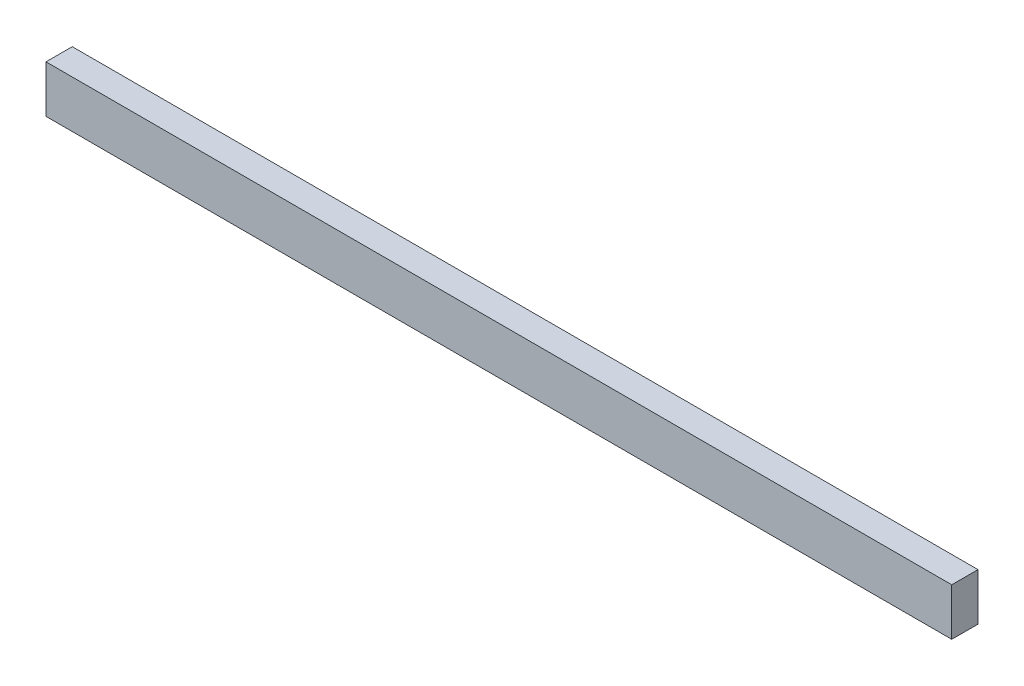
ISO-10303-21;
HEADER;
FILE_DESCRIPTION(('STEP AP214'),'2;1');
FILE_NAME('part.step','',(''),(''),'','','');
FILE_SCHEMA(('AUTOMOTIVE_DESIGN { 1 0 10303 214 1 1 1 1 }'));
ENDSEC;
DATA;
#1=APPLICATION_CONTEXT('core data for automotive mechanical design processes');
#2=APPLICATION_PROTOCOL_DEFINITION('international standard','automotive_design',2000,#1);
#3=PRODUCT_CONTEXT('',#1,'mechanical');
#4=PRODUCT('Part','Part','',(#3));
#5=PRODUCT_RELATED_PRODUCT_CATEGORY('part','',(#4));
#6=PRODUCT_DEFINITION_FORMATION('','',#4);
#7=PRODUCT_DEFINITION_CONTEXT('part definition',#1,'design');
#8=PRODUCT_DEFINITION('design','',#6,#7);
#9=PRODUCT_DEFINITION_SHAPE('','',#8);
#10=(LENGTH_UNIT() NAMED_UNIT(*) SI_UNIT(.MILLI.,.METRE.));
#11=(NAMED_UNIT(*) PLANE_ANGLE_UNIT() SI_UNIT($,.RADIAN.));
#12=(NAMED_UNIT(*) SI_UNIT($,.STERADIAN.) SOLID_ANGLE_UNIT());
#13=UNCERTAINTY_MEASURE_WITH_UNIT(LENGTH_MEASURE(1.E-05),#10,'distance_accuracy_value','');
#14=(GEOMETRIC_REPRESENTATION_CONTEXT(3) GLOBAL_UNCERTAINTY_ASSIGNED_CONTEXT((#13)) GLOBAL_UNIT_ASSIGNED_CONTEXT((#10,
#11,#12)) REPRESENTATION_CONTEXT('',''));
#15=CARTESIAN_POINT('',(0.,0.,0.));
#16=DIRECTION('',(0.,0.,1.));
#17=DIRECTION('',(1.,0.,0.));
#18=AXIS2_PLACEMENT_3D('',#15,#16,#17);
#19=CARTESIAN_POINT('',(0.,36.,20.));
#20=DIRECTION('',(1.,0.,0.));
#21=DIRECTION('',(0.,0.,-1.));
#22=AXIS2_PLACEMENT_3D('',#19,#20,#21);
#23=PLANE('',#22);
#24=DIRECTION('',(0.,-1.,0.));
#25=VECTOR('',#24,1.);
#26=CARTESIAN_POINT('',(0.,36.,0.));
#27=LINE('',#26,#25);
#28=CARTESIAN_POINT('',(0.,36.,0.));
#29=VERTEX_POINT('',#28);
#30=CARTESIAN_POINT('',(0.,0.,0.));
#31=VERTEX_POINT('',#30);
#32=EDGE_CURVE('E102',#29,#31,#27,.T.);
#33=ORIENTED_EDGE('',*,*,#32,.T.);
#34=DIRECTION('',(0.,0.,-1.));
#35=VECTOR('',#34,1.);
#36=CARTESIAN_POINT('',(0.,0.,20.));
#37=LINE('',#36,#35);
#38=CARTESIAN_POINT('',(0.,0.,20.));
#39=VERTEX_POINT('',#38);
#40=EDGE_CURVE('E11',#39,#31,#37,.T.);
#41=ORIENTED_EDGE('',*,*,#40,.F.);
#42=DIRECTION('',(0.,-1.,0.));
#43=VECTOR('',#42,1.);
#44=CARTESIAN_POINT('',(0.,36.,20.));
#45=LINE('',#44,#43);
#46=CARTESIAN_POINT('',(0.,36.,20.));
#47=VERTEX_POINT('',#46);
#48=EDGE_CURVE('E90',#47,#39,#45,.T.);
#49=ORIENTED_EDGE('',*,*,#48,.F.);
#50=DIRECTION('',(0.,0.,-1.));
#51=VECTOR('',#50,1.);
#52=CARTESIAN_POINT('',(0.,36.,20.));
#53=LINE('',#52,#51);
#54=EDGE_CURVE('E98',#47,#29,#53,.T.);
#55=ORIENTED_EDGE('',*,*,#54,.T.);
#56=EDGE_LOOP('',(#33,#41,#49,#55));
#57=FACE_BOUND('',#56,.T.);
#58=ADVANCED_FACE('F39',(#57),#23,.F.);
#59=CARTESIAN_POINT('',(0.,0.,20.));
#60=DIRECTION('',(0.,1.,0.));
#61=DIRECTION('',(0.,0.,1.));
#62=AXIS2_PLACEMENT_3D('',#59,#60,#61);
#63=PLANE('',#62);
#64=DIRECTION('',(1.,0.,0.));
#65=VECTOR('',#64,1.);
#66=CARTESIAN_POINT('',(0.,0.,0.));
#67=LINE('',#66,#65);
#68=CARTESIAN_POINT('',(690.,0.,0.));
#69=VERTEX_POINT('',#68);
#70=EDGE_CURVE('E94',#31,#69,#67,.T.);
#71=ORIENTED_EDGE('',*,*,#70,.T.);
#72=DIRECTION('',(0.,0.,-1.));
#73=VECTOR('',#72,1.);
#74=CARTESIAN_POINT('',(690.,0.,20.));
#75=LINE('',#74,#73);
#76=CARTESIAN_POINT('',(690.,0.,20.));
#77=VERTEX_POINT('',#76);
#78=EDGE_CURVE('E47',#77,#69,#75,.T.);
#79=ORIENTED_EDGE('',*,*,#78,.F.);
#80=DIRECTION('',(1.,0.,0.));
#81=VECTOR('',#80,1.);
#82=CARTESIAN_POINT('',(0.,0.,20.));
#83=LINE('',#82,#81);
#84=EDGE_CURVE('E85',#39,#77,#83,.T.);
#85=ORIENTED_EDGE('',*,*,#84,.F.);
#86=ORIENTED_EDGE('',*,*,#40,.T.);
#87=EDGE_LOOP('',(#71,#79,#85,#86));
#88=FACE_BOUND('',#87,.T.);
#89=ADVANCED_FACE('F93',(#88),#63,.F.);
#90=CARTESIAN_POINT('',(690.,0.,20.));
#91=DIRECTION('',(-1.,0.,0.));
#92=DIRECTION('',(0.,0.,1.));
#93=AXIS2_PLACEMENT_3D('',#90,#91,#92);
#94=PLANE('',#93);
#95=DIRECTION('',(0.,1.,0.));
#96=VECTOR('',#95,1.);
#97=CARTESIAN_POINT('',(690.,0.,0.));
#98=LINE('',#97,#96);
#99=CARTESIAN_POINT('',(690.,36.,0.));
#100=VERTEX_POINT('',#99);
#101=EDGE_CURVE('E72',#69,#100,#98,.T.);
#102=ORIENTED_EDGE('',*,*,#101,.T.);
#103=DIRECTION('',(0.,0.,-1.));
#104=VECTOR('',#103,1.);
#105=CARTESIAN_POINT('',(690.,36.,20.));
#106=LINE('',#105,#104);
#107=CARTESIAN_POINT('',(690.,36.,20.));
#108=VERTEX_POINT('',#107);
#109=EDGE_CURVE('E95',#108,#100,#106,.T.);
#110=ORIENTED_EDGE('',*,*,#109,.F.);
#111=DIRECTION('',(0.,1.,0.));
#112=VECTOR('',#111,1.);
#113=CARTESIAN_POINT('',(690.,0.,20.));
#114=LINE('',#113,#112);
#115=EDGE_CURVE('E88',#77,#108,#114,.T.);
#116=ORIENTED_EDGE('',*,*,#115,.F.);
#117=ORIENTED_EDGE('',*,*,#78,.T.);
#118=EDGE_LOOP('',(#102,#110,#116,#117));
#119=FACE_BOUND('',#118,.T.);
#120=ADVANCED_FACE('F96',(#119),#94,.F.);
#121=CARTESIAN_POINT('',(690.,36.,20.));
#122=DIRECTION('',(0.,-1.,0.));
#123=DIRECTION('',(0.,0.,-1.));
#124=AXIS2_PLACEMENT_3D('',#121,#122,#123);
#125=PLANE('',#124);
#126=DIRECTION('',(-1.,0.,0.));
#127=VECTOR('',#126,1.);
#128=CARTESIAN_POINT('',(690.,36.,0.));
#129=LINE('',#128,#127);
#130=EDGE_CURVE('E78',#100,#29,#129,.T.);
#131=ORIENTED_EDGE('',*,*,#130,.T.);
#132=ORIENTED_EDGE('',*,*,#54,.F.);
#133=DIRECTION('',(-1.,0.,0.));
#134=VECTOR('',#133,1.);
#135=CARTESIAN_POINT('',(690.,36.,20.));
#136=LINE('',#135,#134);
#137=EDGE_CURVE('E55',#108,#47,#136,.T.);
#138=ORIENTED_EDGE('',*,*,#137,.F.);
#139=ORIENTED_EDGE('',*,*,#109,.T.);
#140=EDGE_LOOP('',(#131,#132,#138,#139));
#141=FACE_BOUND('',#140,.T.);
#142=ADVANCED_FACE('F109',(#141),#125,.F.);
#143=CARTESIAN_POINT('',(0.,0.,20.));
#144=DIRECTION('',(0.,0.,1.));
#145=DIRECTION('',(1.,0.,0.));
#146=AXIS2_PLACEMENT_3D('',#143,#144,#145);
#147=PLANE('',#146);
#148=ORIENTED_EDGE('',*,*,#48,.T.);
#149=ORIENTED_EDGE('',*,*,#84,.T.);
#150=ORIENTED_EDGE('',*,*,#115,.T.);
#151=ORIENTED_EDGE('',*,*,#137,.T.);
#152=EDGE_LOOP('',(#148,#149,#150,#151));
#153=FACE_BOUND('',#152,.T.);
#154=ADVANCED_FACE('F86',(#153),#147,.T.);
#155=CARTESIAN_POINT('',(0.,0.,0.));
#156=DIRECTION('',(0.,0.,1.));
#157=DIRECTION('',(1.,0.,0.));
#158=AXIS2_PLACEMENT_3D('',#155,#156,#157);
#159=PLANE('',#158);
#160=ORIENTED_EDGE('',*,*,#32,.F.);
#161=ORIENTED_EDGE('',*,*,#130,.F.);
#162=ORIENTED_EDGE('',*,*,#101,.F.);
#163=ORIENTED_EDGE('',*,*,#70,.F.);
#164=EDGE_LOOP('',(#160,#161,#162,#163));
#165=FACE_BOUND('',#164,.T.);
#166=ADVANCED_FACE('F112',(#165),#159,.F.);
#167=CLOSED_SHELL('',(#58,#89,#120,#142,#154,#166));
#168=MANIFOLD_SOLID_BREP('B2',#167);
#169=ADVANCED_BREP_SHAPE_REPRESENTATION('',(#18,#168),#14);
#170=SHAPE_DEFINITION_REPRESENTATION(#9,#169);
ENDSEC;
END-ISO-10303-21;
